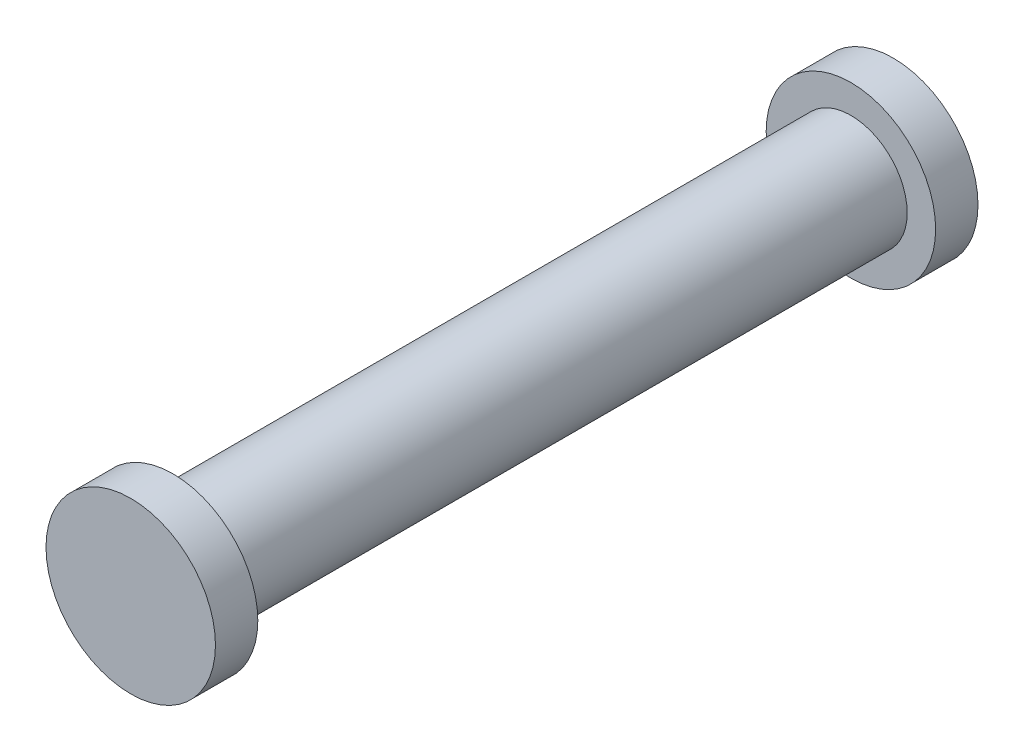
ISO-10303-21;
HEADER;
FILE_DESCRIPTION(('STEP AP214'),'2;1');
FILE_NAME('part.step','',(''),(''),'','','');
FILE_SCHEMA(('AUTOMOTIVE_DESIGN { 1 0 10303 214 1 1 1 1 }'));
ENDSEC;
DATA;
#1=APPLICATION_CONTEXT('core data for automotive mechanical design processes');
#2=APPLICATION_PROTOCOL_DEFINITION('international standard','automotive_design',2000,#1);
#3=PRODUCT_CONTEXT('',#1,'mechanical');
#4=PRODUCT('Part','Part','',(#3));
#5=PRODUCT_RELATED_PRODUCT_CATEGORY('part','',(#4));
#6=PRODUCT_DEFINITION_FORMATION('','',#4);
#7=PRODUCT_DEFINITION_CONTEXT('part definition',#1,'design');
#8=PRODUCT_DEFINITION('design','',#6,#7);
#9=PRODUCT_DEFINITION_SHAPE('','',#8);
#10=(LENGTH_UNIT() NAMED_UNIT(*) SI_UNIT(.MILLI.,.METRE.));
#11=(NAMED_UNIT(*) PLANE_ANGLE_UNIT() SI_UNIT($,.RADIAN.));
#12=(NAMED_UNIT(*) SI_UNIT($,.STERADIAN.) SOLID_ANGLE_UNIT());
#13=UNCERTAINTY_MEASURE_WITH_UNIT(LENGTH_MEASURE(1.E-05),#10,'distance_accuracy_value','');
#14=(GEOMETRIC_REPRESENTATION_CONTEXT(3) GLOBAL_UNCERTAINTY_ASSIGNED_CONTEXT((#13)) GLOBAL_UNIT_ASSIGNED_CONTEXT((#10,
#11,#12)) REPRESENTATION_CONTEXT('',''));
#15=CARTESIAN_POINT('',(0.,0.,0.));
#16=DIRECTION('',(0.,0.,1.));
#17=DIRECTION('',(1.,0.,0.));
#18=AXIS2_PLACEMENT_3D('',#15,#16,#17);
#19=CARTESIAN_POINT('',(0.,0.,50.8));
#20=DIRECTION('',(0.,0.,-1.));
#21=DIRECTION('',(-1.,0.,0.));
#22=AXIS2_PLACEMENT_3D('',#19,#20,#21);
#23=CYLINDRICAL_SURFACE('',#22,4.2164);
#24=CARTESIAN_POINT('',(0.,0.,50.8));
#25=DIRECTION('',(0.,0.,1.));
#26=DIRECTION('',(1.,0.,0.));
#27=AXIS2_PLACEMENT_3D('',#24,#25,#26);
#28=CIRCLE('',#27,4.2164);
#29=CARTESIAN_POINT('',(4.2164,0.,50.8));
#30=VERTEX_POINT('',#29);
#31=EDGE_CURVE('E10',#30,#30,#28,.T.);
#32=ORIENTED_EDGE('',*,*,#31,.F.);
#33=EDGE_LOOP('',(#32));
#34=FACE_BOUND('',#33,.T.);
#35=CARTESIAN_POINT('',(0.,0.,0.));
#36=DIRECTION('',(0.,0.,1.));
#37=DIRECTION('',(1.,0.,0.));
#38=AXIS2_PLACEMENT_3D('',#35,#36,#37);
#39=CIRCLE('',#38,4.2164);
#40=CARTESIAN_POINT('',(4.2164,0.,0.));
#41=VERTEX_POINT('',#40);
#42=EDGE_CURVE('E44',#41,#41,#39,.T.);
#43=ORIENTED_EDGE('',*,*,#42,.T.);
#44=EDGE_LOOP('',(#43));
#45=FACE_BOUND('',#44,.T.);
#46=ADVANCED_FACE('F41',(#34,#45),#23,.T.);
#47=CARTESIAN_POINT('',(0.,0.,53.975));
#48=DIRECTION('',(0.,0.,-1.));
#49=DIRECTION('',(-1.,0.,0.));
#50=AXIS2_PLACEMENT_3D('',#47,#48,#49);
#51=CYLINDRICAL_SURFACE('',#50,6.35);
#52=CARTESIAN_POINT('',(0.,0.,53.975));
#53=DIRECTION('',(0.,0.,1.));
#54=DIRECTION('',(1.,0.,0.));
#55=AXIS2_PLACEMENT_3D('',#52,#53,#54);
#56=CIRCLE('',#55,6.35);
#57=CARTESIAN_POINT('',(6.35,0.,53.975));
#58=VERTEX_POINT('',#57);
#59=EDGE_CURVE('E49',#58,#58,#56,.T.);
#60=ORIENTED_EDGE('',*,*,#59,.F.);
#61=EDGE_LOOP('',(#60));
#62=FACE_BOUND('',#61,.T.);
#63=CARTESIAN_POINT('',(0.,0.,50.8));
#64=DIRECTION('',(0.,0.,1.));
#65=DIRECTION('',(1.,0.,0.));
#66=AXIS2_PLACEMENT_3D('',#63,#64,#65);
#67=CIRCLE('',#66,6.35);
#68=CARTESIAN_POINT('',(6.35,0.,50.8));
#69=VERTEX_POINT('',#68);
#70=EDGE_CURVE('E54',#69,#69,#67,.T.);
#71=ORIENTED_EDGE('',*,*,#70,.T.);
#72=EDGE_LOOP('',(#71));
#73=FACE_BOUND('',#72,.T.);
#74=ADVANCED_FACE('F95',(#62,#73),#51,.T.);
#75=CARTESIAN_POINT('',(0.,0.,53.975));
#76=DIRECTION('',(0.,0.,1.));
#77=DIRECTION('',(1.,0.,0.));
#78=AXIS2_PLACEMENT_3D('',#75,#76,#77);
#79=PLANE('',#78);
#80=ORIENTED_EDGE('',*,*,#59,.T.);
#81=EDGE_LOOP('',(#80));
#82=FACE_BOUND('',#81,.T.);
#83=ADVANCED_FACE('F91',(#82),#79,.T.);
#84=CARTESIAN_POINT('',(0.,0.,50.8));
#85=DIRECTION('',(0.,0.,1.));
#86=DIRECTION('',(1.,0.,0.));
#87=AXIS2_PLACEMENT_3D('',#84,#85,#86);
#88=PLANE('',#87);
#89=ORIENTED_EDGE('',*,*,#31,.T.);
#90=EDGE_LOOP('',(#89));
#91=FACE_BOUND('',#90,.T.);
#92=ORIENTED_EDGE('',*,*,#70,.F.);
#93=EDGE_LOOP('',(#92));
#94=FACE_BOUND('',#93,.T.);
#95=ADVANCED_FACE('F83',(#91,#94),#88,.F.);
#96=CARTESIAN_POINT('',(0.,0.,-3.175));
#97=DIRECTION('',(0.,0.,1.));
#98=DIRECTION('',(1.,0.,0.));
#99=AXIS2_PLACEMENT_3D('',#96,#97,#98);
#100=CYLINDRICAL_SURFACE('',#99,6.35);
#101=CARTESIAN_POINT('',(0.,0.,-3.175));
#102=DIRECTION('',(0.,0.,-1.));
#103=DIRECTION('',(-1.,0.,0.));
#104=AXIS2_PLACEMENT_3D('',#101,#102,#103);
#105=CIRCLE('',#104,6.35);
#106=CARTESIAN_POINT('',(-6.35,0.,-3.175));
#107=VERTEX_POINT('',#106);
#108=EDGE_CURVE('E64',#107,#107,#105,.T.);
#109=ORIENTED_EDGE('',*,*,#108,.F.);
#110=EDGE_LOOP('',(#109));
#111=FACE_BOUND('',#110,.T.);
#112=CARTESIAN_POINT('',(0.,0.,0.));
#113=DIRECTION('',(0.,0.,-1.));
#114=DIRECTION('',(-1.,0.,0.));
#115=AXIS2_PLACEMENT_3D('',#112,#113,#114);
#116=CIRCLE('',#115,6.35);
#117=CARTESIAN_POINT('',(-6.35,0.,0.));
#118=VERTEX_POINT('',#117);
#119=EDGE_CURVE('E60',#118,#118,#116,.T.);
#120=ORIENTED_EDGE('',*,*,#119,.T.);
#121=EDGE_LOOP('',(#120));
#122=FACE_BOUND('',#121,.T.);
#123=ADVANCED_FACE('F81',(#111,#122),#100,.T.);
#124=CARTESIAN_POINT('',(0.,0.,-3.175));
#125=DIRECTION('',(0.,0.,-1.));
#126=DIRECTION('',(-1.,0.,0.));
#127=AXIS2_PLACEMENT_3D('',#124,#125,#126);
#128=PLANE('',#127);
#129=ORIENTED_EDGE('',*,*,#108,.T.);
#130=EDGE_LOOP('',(#129));
#131=FACE_BOUND('',#130,.T.);
#132=ADVANCED_FACE('F77',(#131),#128,.T.);
#133=CARTESIAN_POINT('',(0.,0.,0.));
#134=DIRECTION('',(0.,0.,-1.));
#135=DIRECTION('',(-1.,0.,0.));
#136=AXIS2_PLACEMENT_3D('',#133,#134,#135);
#137=PLANE('',#136);
#138=ORIENTED_EDGE('',*,*,#42,.F.);
#139=EDGE_LOOP('',(#138));
#140=FACE_BOUND('',#139,.T.);
#141=ORIENTED_EDGE('',*,*,#119,.F.);
#142=EDGE_LOOP('',(#141));
#143=FACE_BOUND('',#142,.T.);
#144=ADVANCED_FACE('F74',(#140,#143),#137,.F.);
#145=CLOSED_SHELL('',(#46,#74,#83,#95,#123,#132,#144));
#146=MANIFOLD_SOLID_BREP('B2',#145);
#147=ADVANCED_BREP_SHAPE_REPRESENTATION('',(#18,#146),#14);
#148=SHAPE_DEFINITION_REPRESENTATION(#9,#147);
ENDSEC;
END-ISO-10303-21;
